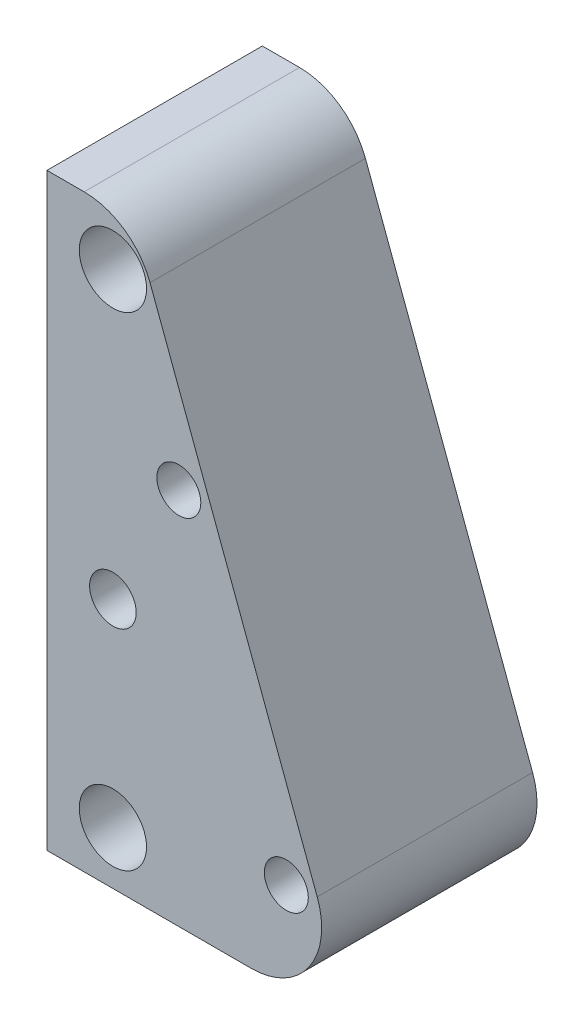
ISO-10303-21;
HEADER;
FILE_DESCRIPTION(('STEP AP214'),'2;1');
FILE_NAME('part.step','',(''),(''),'','','');
FILE_SCHEMA(('AUTOMOTIVE_DESIGN { 1 0 10303 214 1 1 1 1 }'));
ENDSEC;
DATA;
#1=APPLICATION_CONTEXT('core data for automotive mechanical design processes');
#2=APPLICATION_PROTOCOL_DEFINITION('international standard','automotive_design',2000,#1);
#3=PRODUCT_CONTEXT('',#1,'mechanical');
#4=PRODUCT('Part','Part','',(#3));
#5=PRODUCT_RELATED_PRODUCT_CATEGORY('part','',(#4));
#6=PRODUCT_DEFINITION_FORMATION('','',#4);
#7=PRODUCT_DEFINITION_CONTEXT('part definition',#1,'design');
#8=PRODUCT_DEFINITION('design','',#6,#7);
#9=PRODUCT_DEFINITION_SHAPE('','',#8);
#10=(LENGTH_UNIT() NAMED_UNIT(*) SI_UNIT(.MILLI.,.METRE.));
#11=(NAMED_UNIT(*) PLANE_ANGLE_UNIT() SI_UNIT($,.RADIAN.));
#12=(NAMED_UNIT(*) SI_UNIT($,.STERADIAN.) SOLID_ANGLE_UNIT());
#13=UNCERTAINTY_MEASURE_WITH_UNIT(LENGTH_MEASURE(1.E-05),#10,'distance_accuracy_value','');
#14=(GEOMETRIC_REPRESENTATION_CONTEXT(3) GLOBAL_UNCERTAINTY_ASSIGNED_CONTEXT((#13)) GLOBAL_UNIT_ASSIGNED_CONTEXT((#10,
#11,#12)) REPRESENTATION_CONTEXT('',''));
#15=CARTESIAN_POINT('',(0.,0.,0.));
#16=DIRECTION('',(0.,0.,1.));
#17=DIRECTION('',(1.,0.,0.));
#18=AXIS2_PLACEMENT_3D('',#15,#16,#17);
#19=CARTESIAN_POINT('',(0.,0.,49.));
#20=DIRECTION('',(0.,0.,-1.));
#21=DIRECTION('',(-1.,0.,0.));
#22=AXIS2_PLACEMENT_3D('',#19,#20,#21);
#23=CYLINDRICAL_SURFACE('',#22,5.3);
#24=CARTESIAN_POINT('',(0.,0.,49.));
#25=DIRECTION('',(0.,0.,1.));
#26=DIRECTION('',(1.,0.,0.));
#27=AXIS2_PLACEMENT_3D('',#24,#25,#26);
#28=CIRCLE('',#27,5.3);
#29=CARTESIAN_POINT('',(5.3,0.,49.));
#30=VERTEX_POINT('',#29);
#31=EDGE_CURVE('E191',#30,#30,#28,.T.);
#32=ORIENTED_EDGE('',*,*,#31,.T.);
#33=EDGE_LOOP('',(#32));
#34=FACE_BOUND('',#33,.T.);
#35=CARTESIAN_POINT('',(0.,0.,4.));
#36=DIRECTION('',(0.,0.,-1.));
#37=DIRECTION('',(-1.,0.,0.));
#38=AXIS2_PLACEMENT_3D('',#35,#36,#37);
#39=CIRCLE('',#38,5.3);
#40=CARTESIAN_POINT('',(-5.3,0.,4.));
#41=VERTEX_POINT('',#40);
#42=EDGE_CURVE('E49',#41,#41,#39,.T.);
#43=ORIENTED_EDGE('',*,*,#42,.T.);
#44=EDGE_LOOP('',(#43));
#45=FACE_BOUND('',#44,.T.);
#46=ADVANCED_FACE('F45',(#34,#45),#23,.F.);
#47=CARTESIAN_POINT('',(0.,0.,49.));
#48=DIRECTION('',(0.,0.,-1.));
#49=DIRECTION('',(-1.,0.,0.));
#50=AXIS2_PLACEMENT_3D('',#47,#48,#49);
#51=PLANE('',#50);
#52=DIRECTION('',(-0.349389847328426,0.936977446144687,0.));
#53=VECTOR('',#52,1.);
#54=CARTESIAN_POINT('',(4.57209406483869,77.,49.));
#55=LINE('',#54,#53);
#56=CARTESIAN_POINT('',(46.488609664757,-35.4097624427452,49.));
#57=VERTEX_POINT('',#56);
#58=CARTESIAN_POINT('',(8.45379401990281,66.5902375572548,49.));
#59=VERTEX_POINT('',#58);
#60=EDGE_CURVE('E113',#57,#59,#55,.T.);
#61=ORIENTED_EDGE('',*,*,#60,.T.);
#62=CARTESIAN_POINT('',(-6.53784511841218,61.,49.));
#63=DIRECTION('',(0.,0.,-1.));
#64=DIRECTION('',(-1.,0.,0.));
#65=AXIS2_PLACEMENT_3D('',#62,#63,#64);
#66=CIRCLE('',#65,16.);
#67=CARTESIAN_POINT('',(-6.53784511841218,77.,49.));
#68=VERTEX_POINT('',#67);
#69=EDGE_CURVE('E55',#59,#68,#66,.F.);
#70=ORIENTED_EDGE('',*,*,#69,.T.);
#71=DIRECTION('',(-1.,0.,0.));
#72=VECTOR('',#71,1.);
#73=CARTESIAN_POINT('',(-15.,77.,49.));
#74=LINE('',#73,#72);
#75=CARTESIAN_POINT('',(-15.,77.,49.));
#76=VERTEX_POINT('',#75);
#77=EDGE_CURVE('E101',#68,#76,#74,.T.);
#78=ORIENTED_EDGE('',*,*,#77,.T.);
#79=DIRECTION('',(0.,-1.,0.));
#80=VECTOR('',#79,1.);
#81=CARTESIAN_POINT('',(-15.,-57.,49.));
#82=LINE('',#81,#80);
#83=CARTESIAN_POINT('',(-15.,-57.,49.));
#84=VERTEX_POINT('',#83);
#85=EDGE_CURVE('E106',#76,#84,#82,.T.);
#86=ORIENTED_EDGE('',*,*,#85,.T.);
#87=DIRECTION('',(1.,0.,0.));
#88=VECTOR('',#87,1.);
#89=CARTESIAN_POINT('',(54.5394008923923,-57.,49.));
#90=LINE('',#89,#88);
#91=CARTESIAN_POINT('',(31.4969705264421,-57.,49.));
#92=VERTEX_POINT('',#91);
#93=EDGE_CURVE('E145',#84,#92,#90,.T.);
#94=ORIENTED_EDGE('',*,*,#93,.T.);
#95=CARTESIAN_POINT('',(31.4969705264421,-41.,49.));
#96=DIRECTION('',(0.,0.,-1.));
#97=DIRECTION('',(-1.,0.,0.));
#98=AXIS2_PLACEMENT_3D('',#95,#96,#97);
#99=CIRCLE('',#98,16.);
#100=EDGE_CURVE('E161',#92,#57,#99,.F.);
#101=ORIENTED_EDGE('',*,*,#100,.T.);
#102=EDGE_LOOP('',(#61,#70,#78,#86,#94,#101));
#103=FACE_BOUND('',#102,.T.);
#104=CARTESIAN_POINT('',(0.,65.,49.));
#105=DIRECTION('',(0.,0.,1.));
#106=DIRECTION('',(1.,0.,0.));
#107=AXIS2_PLACEMENT_3D('',#104,#105,#106);
#108=CIRCLE('',#107,7.65);
#109=CARTESIAN_POINT('',(7.65,65.,49.));
#110=VERTEX_POINT('',#109);
#111=EDGE_CURVE('E138',#110,#110,#108,.T.);
#112=ORIENTED_EDGE('',*,*,#111,.F.);
#113=EDGE_LOOP('',(#112));
#114=FACE_BOUND('',#113,.T.);
#115=CARTESIAN_POINT('',(0.,-45.,49.));
#116=DIRECTION('',(0.,0.,1.));
#117=DIRECTION('',(1.,0.,0.));
#118=AXIS2_PLACEMENT_3D('',#115,#116,#117);
#119=CIRCLE('',#118,7.65);
#120=CARTESIAN_POINT('',(7.65,-45.,49.));
#121=VERTEX_POINT('',#120);
#122=EDGE_CURVE('E183',#121,#121,#119,.T.);
#123=ORIENTED_EDGE('',*,*,#122,.F.);
#124=EDGE_LOOP('',(#123));
#125=FACE_BOUND('',#124,.T.);
#126=ORIENTED_EDGE('',*,*,#31,.F.);
#127=EDGE_LOOP('',(#126));
#128=FACE_BOUND('',#127,.T.);
#129=CARTESIAN_POINT('',(15.,29.,49.));
#130=DIRECTION('',(0.,0.,1.));
#131=DIRECTION('',(1.,0.,0.));
#132=AXIS2_PLACEMENT_3D('',#129,#130,#131);
#133=CIRCLE('',#132,5.);
#134=CARTESIAN_POINT('',(20.,29.,49.));
#135=VERTEX_POINT('',#134);
#136=EDGE_CURVE('E198',#135,#135,#133,.T.);
#137=ORIENTED_EDGE('',*,*,#136,.F.);
#138=EDGE_LOOP('',(#137));
#139=FACE_BOUND('',#138,.T.);
#140=CARTESIAN_POINT('',(39.4572893129898,-36.5884212301281,49.));
#141=DIRECTION('',(0.,0.,1.));
#142=DIRECTION('',(1.,0.,0.));
#143=AXIS2_PLACEMENT_3D('',#140,#141,#142);
#144=CIRCLE('',#143,5.00000000000001);
#145=CARTESIAN_POINT('',(44.4572893129898,-36.5884212301281,49.));
#146=VERTEX_POINT('',#145);
#147=EDGE_CURVE('E203',#146,#146,#144,.T.);
#148=ORIENTED_EDGE('',*,*,#147,.F.);
#149=EDGE_LOOP('',(#148));
#150=FACE_BOUND('',#149,.T.);
#151=ADVANCED_FACE('F103',(#103,#114,#125,#128,#139,#150),#51,.F.);
#152=CARTESIAN_POINT('',(0.,0.,0.));
#153=DIRECTION('',(0.,0.,-1.));
#154=DIRECTION('',(-1.,0.,0.));
#155=AXIS2_PLACEMENT_3D('',#152,#153,#154);
#156=PLANE('',#155);
#157=CARTESIAN_POINT('',(0.,0.,0.));
#158=DIRECTION('',(0.,0.,-1.));
#159=DIRECTION('',(-1.,0.,0.));
#160=AXIS2_PLACEMENT_3D('',#157,#158,#159);
#161=CIRCLE('',#160,11.);
#162=CARTESIAN_POINT('',(-11.,0.,0.));
#163=VERTEX_POINT('',#162);
#164=EDGE_CURVE('E214',#163,#163,#161,.T.);
#165=ORIENTED_EDGE('',*,*,#164,.F.);
#166=EDGE_LOOP('',(#165));
#167=FACE_BOUND('',#166,.T.);
#168=CARTESIAN_POINT('',(15.,29.,0.));
#169=DIRECTION('',(0.,0.,1.));
#170=DIRECTION('',(1.,0.,0.));
#171=AXIS2_PLACEMENT_3D('',#168,#169,#170);
#172=CIRCLE('',#171,5.);
#173=CARTESIAN_POINT('',(20.,29.,0.));
#174=VERTEX_POINT('',#173);
#175=EDGE_CURVE('E199',#174,#174,#172,.T.);
#176=ORIENTED_EDGE('',*,*,#175,.T.);
#177=EDGE_LOOP('',(#176));
#178=FACE_BOUND('',#177,.T.);
#179=CARTESIAN_POINT('',(0.,-45.,0.));
#180=DIRECTION('',(0.,0.,1.));
#181=DIRECTION('',(1.,0.,0.));
#182=AXIS2_PLACEMENT_3D('',#179,#180,#181);
#183=CIRCLE('',#182,7.65);
#184=CARTESIAN_POINT('',(7.65,-45.,0.));
#185=VERTEX_POINT('',#184);
#186=EDGE_CURVE('E187',#185,#185,#183,.T.);
#187=ORIENTED_EDGE('',*,*,#186,.T.);
#188=EDGE_LOOP('',(#187));
#189=FACE_BOUND('',#188,.T.);
#190=DIRECTION('',(-1.,0.,0.));
#191=VECTOR('',#190,1.);
#192=CARTESIAN_POINT('',(-15.,77.,0.));
#193=LINE('',#192,#191);
#194=CARTESIAN_POINT('',(-6.53784511841218,77.,0.));
#195=VERTEX_POINT('',#194);
#196=CARTESIAN_POINT('',(-15.,77.,0.));
#197=VERTEX_POINT('',#196);
#198=EDGE_CURVE('E119',#195,#197,#193,.T.);
#199=ORIENTED_EDGE('',*,*,#198,.F.);
#200=CARTESIAN_POINT('',(-6.53784511841218,61.,0.));
#201=DIRECTION('',(0.,0.,-1.));
#202=DIRECTION('',(-1.,0.,0.));
#203=AXIS2_PLACEMENT_3D('',#200,#201,#202);
#204=CIRCLE('',#203,16.);
#205=CARTESIAN_POINT('',(8.45379401990281,66.5902375572548,0.));
#206=VERTEX_POINT('',#205);
#207=EDGE_CURVE('E152',#195,#206,#204,.T.);
#208=ORIENTED_EDGE('',*,*,#207,.T.);
#209=DIRECTION('',(-0.349389847328426,0.936977446144687,0.));
#210=VECTOR('',#209,1.);
#211=CARTESIAN_POINT('',(4.57209406483869,77.,0.));
#212=LINE('',#211,#210);
#213=CARTESIAN_POINT('',(46.488609664757,-35.4097624427452,0.));
#214=VERTEX_POINT('',#213);
#215=EDGE_CURVE('E137',#214,#206,#212,.T.);
#216=ORIENTED_EDGE('',*,*,#215,.F.);
#217=CARTESIAN_POINT('',(31.4969705264421,-41.,0.));
#218=DIRECTION('',(0.,0.,-1.));
#219=DIRECTION('',(-1.,0.,0.));
#220=AXIS2_PLACEMENT_3D('',#217,#218,#219);
#221=CIRCLE('',#220,16.);
#222=CARTESIAN_POINT('',(31.4969705264421,-57.,0.));
#223=VERTEX_POINT('',#222);
#224=EDGE_CURVE('E149',#214,#223,#221,.T.);
#225=ORIENTED_EDGE('',*,*,#224,.T.);
#226=DIRECTION('',(1.,0.,0.));
#227=VECTOR('',#226,1.);
#228=CARTESIAN_POINT('',(54.5394008923923,-57.,0.));
#229=LINE('',#228,#227);
#230=CARTESIAN_POINT('',(-15.,-57.,0.));
#231=VERTEX_POINT('',#230);
#232=EDGE_CURVE('E134',#231,#223,#229,.T.);
#233=ORIENTED_EDGE('',*,*,#232,.F.);
#234=DIRECTION('',(0.,-1.,0.));
#235=VECTOR('',#234,1.);
#236=CARTESIAN_POINT('',(-15.,-57.,0.));
#237=LINE('',#236,#235);
#238=EDGE_CURVE('E143',#197,#231,#237,.T.);
#239=ORIENTED_EDGE('',*,*,#238,.F.);
#240=EDGE_LOOP('',(#199,#208,#216,#225,#233,#239));
#241=FACE_BOUND('',#240,.T.);
#242=CARTESIAN_POINT('',(0.,65.,0.));
#243=DIRECTION('',(0.,0.,1.));
#244=DIRECTION('',(1.,0.,0.));
#245=AXIS2_PLACEMENT_3D('',#242,#243,#244);
#246=CIRCLE('',#245,7.65);
#247=CARTESIAN_POINT('',(7.65,65.,0.));
#248=VERTEX_POINT('',#247);
#249=EDGE_CURVE('E179',#248,#248,#246,.T.);
#250=ORIENTED_EDGE('',*,*,#249,.T.);
#251=EDGE_LOOP('',(#250));
#252=FACE_BOUND('',#251,.T.);
#253=CARTESIAN_POINT('',(39.4572893129898,-36.5884212301281,0.));
#254=DIRECTION('',(0.,0.,1.));
#255=DIRECTION('',(1.,0.,0.));
#256=AXIS2_PLACEMENT_3D('',#253,#254,#255);
#257=CIRCLE('',#256,5.00000000000001);
#258=CARTESIAN_POINT('',(44.4572893129898,-36.5884212301281,0.));
#259=VERTEX_POINT('',#258);
#260=EDGE_CURVE('E207',#259,#259,#257,.T.);
#261=ORIENTED_EDGE('',*,*,#260,.T.);
#262=EDGE_LOOP('',(#261));
#263=FACE_BOUND('',#262,.T.);
#264=ADVANCED_FACE('F173',(#167,#178,#189,#241,#252,#263),#156,.T.);
#265=CARTESIAN_POINT('',(54.5394008923923,-57.,49.));
#266=DIRECTION('',(0.,1.,0.));
#267=DIRECTION('',(-1.,0.,0.));
#268=AXIS2_PLACEMENT_3D('',#265,#266,#267);
#269=PLANE('',#268);
#270=ORIENTED_EDGE('',*,*,#232,.T.);
#271=DIRECTION('',(0.,0.,-1.));
#272=VECTOR('',#271,1.);
#273=CARTESIAN_POINT('',(31.4969705264421,-57.,49.));
#274=LINE('',#273,#272);
#275=EDGE_CURVE('E11',#223,#92,#274,.F.);
#276=ORIENTED_EDGE('',*,*,#275,.T.);
#277=ORIENTED_EDGE('',*,*,#93,.F.);
#278=DIRECTION('',(0.,0.,-1.));
#279=VECTOR('',#278,1.);
#280=CARTESIAN_POINT('',(-15.,-57.,49.));
#281=LINE('',#280,#279);
#282=EDGE_CURVE('E124',#84,#231,#281,.T.);
#283=ORIENTED_EDGE('',*,*,#282,.T.);
#284=EDGE_LOOP('',(#270,#276,#277,#283));
#285=FACE_BOUND('',#284,.T.);
#286=ADVANCED_FACE('F175',(#285),#269,.F.);
#287=CARTESIAN_POINT('',(4.57209406483869,77.,49.));
#288=DIRECTION('',(-0.936977446144687,-0.349389847328426,0.));
#289=DIRECTION('',(0.349389847328426,-0.936977446144687,0.));
#290=AXIS2_PLACEMENT_3D('',#287,#288,#289);
#291=PLANE('',#290);
#292=ORIENTED_EDGE('',*,*,#215,.T.);
#293=DIRECTION('',(0.,0.,-1.));
#294=VECTOR('',#293,1.);
#295=CARTESIAN_POINT('',(8.45379401990281,66.5902375572548,49.));
#296=LINE('',#295,#294);
#297=EDGE_CURVE('E68',#206,#59,#296,.F.);
#298=ORIENTED_EDGE('',*,*,#297,.T.);
#299=ORIENTED_EDGE('',*,*,#60,.F.);
#300=DIRECTION('',(0.,0.,-1.));
#301=VECTOR('',#300,1.);
#302=CARTESIAN_POINT('',(46.488609664757,-35.4097624427451,49.));
#303=LINE('',#302,#301);
#304=EDGE_CURVE('E155',#57,#214,#303,.T.);
#305=ORIENTED_EDGE('',*,*,#304,.T.);
#306=EDGE_LOOP('',(#292,#298,#299,#305));
#307=FACE_BOUND('',#306,.T.);
#308=ADVANCED_FACE('F168',(#307),#291,.F.);
#309=CARTESIAN_POINT('',(-15.,77.,49.));
#310=DIRECTION('',(0.,-1.,0.));
#311=DIRECTION('',(0.,0.,-1.));
#312=AXIS2_PLACEMENT_3D('',#309,#310,#311);
#313=PLANE('',#312);
#314=ORIENTED_EDGE('',*,*,#77,.F.);
#315=DIRECTION('',(0.,0.,-1.));
#316=VECTOR('',#315,1.);
#317=CARTESIAN_POINT('',(-6.53784511841218,77.,49.));
#318=LINE('',#317,#316);
#319=EDGE_CURVE('E123',#68,#195,#318,.T.);
#320=ORIENTED_EDGE('',*,*,#319,.T.);
#321=ORIENTED_EDGE('',*,*,#198,.T.);
#322=DIRECTION('',(0.,0.,-1.));
#323=VECTOR('',#322,1.);
#324=CARTESIAN_POINT('',(-15.,77.,49.));
#325=LINE('',#324,#323);
#326=EDGE_CURVE('E116',#76,#197,#325,.T.);
#327=ORIENTED_EDGE('',*,*,#326,.F.);
#328=EDGE_LOOP('',(#314,#320,#321,#327));
#329=FACE_BOUND('',#328,.T.);
#330=ADVANCED_FACE('F117',(#329),#313,.F.);
#331=CARTESIAN_POINT('',(-15.,-57.,49.));
#332=DIRECTION('',(1.,0.,0.));
#333=DIRECTION('',(0.,0.,-1.));
#334=AXIS2_PLACEMENT_3D('',#331,#332,#333);
#335=PLANE('',#334);
#336=ORIENTED_EDGE('',*,*,#238,.T.);
#337=ORIENTED_EDGE('',*,*,#282,.F.);
#338=ORIENTED_EDGE('',*,*,#85,.F.);
#339=ORIENTED_EDGE('',*,*,#326,.T.);
#340=EDGE_LOOP('',(#336,#337,#338,#339));
#341=FACE_BOUND('',#340,.T.);
#342=ADVANCED_FACE('F126',(#341),#335,.F.);
#343=CARTESIAN_POINT('',(0.,65.,49.));
#344=DIRECTION('',(0.,0.,-1.));
#345=DIRECTION('',(-1.,0.,0.));
#346=AXIS2_PLACEMENT_3D('',#343,#344,#345);
#347=CYLINDRICAL_SURFACE('',#346,7.65);
#348=ORIENTED_EDGE('',*,*,#111,.T.);
#349=EDGE_LOOP('',(#348));
#350=FACE_BOUND('',#349,.T.);
#351=ORIENTED_EDGE('',*,*,#249,.F.);
#352=EDGE_LOOP('',(#351));
#353=FACE_BOUND('',#352,.T.);
#354=ADVANCED_FACE('F296',(#350,#353),#347,.F.);
#355=CARTESIAN_POINT('',(0.,-45.,49.));
#356=DIRECTION('',(0.,0.,-1.));
#357=DIRECTION('',(-1.,0.,0.));
#358=AXIS2_PLACEMENT_3D('',#355,#356,#357);
#359=CYLINDRICAL_SURFACE('',#358,7.65);
#360=ORIENTED_EDGE('',*,*,#122,.T.);
#361=EDGE_LOOP('',(#360));
#362=FACE_BOUND('',#361,.T.);
#363=ORIENTED_EDGE('',*,*,#186,.F.);
#364=EDGE_LOOP('',(#363));
#365=FACE_BOUND('',#364,.T.);
#366=ADVANCED_FACE('F293',(#362,#365),#359,.F.);
#367=CARTESIAN_POINT('',(15.,29.,49.));
#368=DIRECTION('',(0.,0.,-1.));
#369=DIRECTION('',(-1.,0.,0.));
#370=AXIS2_PLACEMENT_3D('',#367,#368,#369);
#371=CYLINDRICAL_SURFACE('',#370,5.);
#372=ORIENTED_EDGE('',*,*,#136,.T.);
#373=EDGE_LOOP('',(#372));
#374=FACE_BOUND('',#373,.T.);
#375=ORIENTED_EDGE('',*,*,#175,.F.);
#376=EDGE_LOOP('',(#375));
#377=FACE_BOUND('',#376,.T.);
#378=ADVANCED_FACE('F295',(#374,#377),#371,.F.);
#379=CARTESIAN_POINT('',(39.4572893129898,-36.5884212301281,49.));
#380=DIRECTION('',(0.,0.,-1.));
#381=DIRECTION('',(-1.,0.,0.));
#382=AXIS2_PLACEMENT_3D('',#379,#380,#381);
#383=CYLINDRICAL_SURFACE('',#382,5.00000000000001);
#384=ORIENTED_EDGE('',*,*,#147,.T.);
#385=EDGE_LOOP('',(#384));
#386=FACE_BOUND('',#385,.T.);
#387=ORIENTED_EDGE('',*,*,#260,.F.);
#388=EDGE_LOOP('',(#387));
#389=FACE_BOUND('',#388,.T.);
#390=ADVANCED_FACE('F303',(#386,#389),#383,.F.);
#391=CARTESIAN_POINT('',(-6.53784511841218,61.,49.));
#392=DIRECTION('',(0.,0.,-1.));
#393=DIRECTION('',(-1.,0.,0.));
#394=AXIS2_PLACEMENT_3D('',#391,#392,#393);
#395=CYLINDRICAL_SURFACE('',#394,16.);
#396=ORIENTED_EDGE('',*,*,#69,.F.);
#397=ORIENTED_EDGE('',*,*,#297,.F.);
#398=ORIENTED_EDGE('',*,*,#207,.F.);
#399=ORIENTED_EDGE('',*,*,#319,.F.);
#400=EDGE_LOOP('',(#396,#397,#398,#399));
#401=FACE_BOUND('',#400,.T.);
#402=ADVANCED_FACE('F319',(#401),#395,.T.);
#403=CARTESIAN_POINT('',(31.4969705264421,-41.,49.));
#404=DIRECTION('',(0.,0.,-1.));
#405=DIRECTION('',(-1.,0.,0.));
#406=AXIS2_PLACEMENT_3D('',#403,#404,#405);
#407=CYLINDRICAL_SURFACE('',#406,16.);
#408=ORIENTED_EDGE('',*,*,#100,.F.);
#409=ORIENTED_EDGE('',*,*,#275,.F.);
#410=ORIENTED_EDGE('',*,*,#224,.F.);
#411=ORIENTED_EDGE('',*,*,#304,.F.);
#412=EDGE_LOOP('',(#408,#409,#410,#411));
#413=FACE_BOUND('',#412,.T.);
#414=ADVANCED_FACE('F47',(#413),#407,.T.);
#415=CARTESIAN_POINT('',(0.,0.,4.));
#416=DIRECTION('',(0.,0.,-1.));
#417=DIRECTION('',(-1.,0.,0.));
#418=AXIS2_PLACEMENT_3D('',#415,#416,#417);
#419=CYLINDRICAL_SURFACE('',#418,11.);
#420=CARTESIAN_POINT('',(0.,0.,4.));
#421=DIRECTION('',(0.,0.,-1.));
#422=DIRECTION('',(-1.,0.,0.));
#423=AXIS2_PLACEMENT_3D('',#420,#421,#422);
#424=CIRCLE('',#423,11.);
#425=CARTESIAN_POINT('',(-11.,0.,4.));
#426=VERTEX_POINT('',#425);
#427=EDGE_CURVE('E218',#426,#426,#424,.T.);
#428=ORIENTED_EDGE('',*,*,#427,.F.);
#429=EDGE_LOOP('',(#428));
#430=FACE_BOUND('',#429,.T.);
#431=ORIENTED_EDGE('',*,*,#164,.T.);
#432=EDGE_LOOP('',(#431));
#433=FACE_BOUND('',#432,.T.);
#434=ADVANCED_FACE('F268',(#430,#433),#419,.F.);
#435=CARTESIAN_POINT('',(0.,0.,4.));
#436=DIRECTION('',(0.,0.,-1.));
#437=DIRECTION('',(-1.,0.,0.));
#438=AXIS2_PLACEMENT_3D('',#435,#436,#437);
#439=PLANE('',#438);
#440=CARTESIAN_POINT('',(0.,8.,4.));
#441=DIRECTION('',(0.,0.,-1.));
#442=DIRECTION('',(-1.,0.,0.));
#443=AXIS2_PLACEMENT_3D('',#440,#441,#442);
#444=CIRCLE('',#443,1.21);
#445=CARTESIAN_POINT('',(-1.21,8.,4.));
#446=VERTEX_POINT('',#445);
#447=EDGE_CURVE('E247',#446,#446,#444,.T.);
#448=ORIENTED_EDGE('',*,*,#447,.F.);
#449=EDGE_LOOP('',(#448));
#450=FACE_BOUND('',#449,.T.);
#451=CARTESIAN_POINT('',(-8.,0.,4.));
#452=DIRECTION('',(0.,0.,-1.));
#453=DIRECTION('',(-1.,0.,0.));
#454=AXIS2_PLACEMENT_3D('',#451,#452,#453);
#455=CIRCLE('',#454,1.21);
#456=CARTESIAN_POINT('',(-9.21,0.,4.));
#457=VERTEX_POINT('',#456);
#458=EDGE_CURVE('E243',#457,#457,#455,.T.);
#459=ORIENTED_EDGE('',*,*,#458,.F.);
#460=EDGE_LOOP('',(#459));
#461=FACE_BOUND('',#460,.T.);
#462=CARTESIAN_POINT('',(0.,-8.,4.));
#463=DIRECTION('',(0.,0.,-1.));
#464=DIRECTION('',(-1.,0.,0.));
#465=AXIS2_PLACEMENT_3D('',#462,#463,#464);
#466=CIRCLE('',#465,1.21);
#467=CARTESIAN_POINT('',(-1.20999999999994,-8.,4.));
#468=VERTEX_POINT('',#467);
#469=EDGE_CURVE('E235',#468,#468,#466,.T.);
#470=ORIENTED_EDGE('',*,*,#469,.F.);
#471=EDGE_LOOP('',(#470));
#472=FACE_BOUND('',#471,.T.);
#473=CARTESIAN_POINT('',(8.,0.,4.));
#474=DIRECTION('',(0.,0.,-1.));
#475=DIRECTION('',(-1.,0.,0.));
#476=AXIS2_PLACEMENT_3D('',#473,#474,#475);
#477=CIRCLE('',#476,1.21);
#478=CARTESIAN_POINT('',(6.79,0.,4.));
#479=VERTEX_POINT('',#478);
#480=EDGE_CURVE('E227',#479,#479,#477,.T.);
#481=ORIENTED_EDGE('',*,*,#480,.F.);
#482=EDGE_LOOP('',(#481));
#483=FACE_BOUND('',#482,.T.);
#484=ORIENTED_EDGE('',*,*,#42,.F.);
#485=EDGE_LOOP('',(#484));
#486=FACE_BOUND('',#485,.T.);
#487=ORIENTED_EDGE('',*,*,#427,.T.);
#488=EDGE_LOOP('',(#487));
#489=FACE_BOUND('',#488,.T.);
#490=ADVANCED_FACE('F264',(#450,#461,#472,#483,#486,#489),#439,.T.);
#491=CARTESIAN_POINT('',(8.,0.,19.));
#492=DIRECTION('',(0.,0.,-1.));
#493=DIRECTION('',(-1.,0.,0.));
#494=AXIS2_PLACEMENT_3D('',#491,#492,#493);
#495=CYLINDRICAL_SURFACE('',#494,1.21);
#496=CARTESIAN_POINT('',(8.,0.,19.));
#497=DIRECTION('',(0.,0.,-1.));
#498=DIRECTION('',(-1.,0.,0.));
#499=AXIS2_PLACEMENT_3D('',#496,#497,#498);
#500=CIRCLE('',#499,1.21);
#501=CARTESIAN_POINT('',(6.79,0.,19.));
#502=VERTEX_POINT('',#501);
#503=EDGE_CURVE('E223',#502,#502,#500,.T.);
#504=ORIENTED_EDGE('',*,*,#503,.F.);
#505=EDGE_LOOP('',(#504));
#506=FACE_BOUND('',#505,.T.);
#507=ORIENTED_EDGE('',*,*,#480,.T.);
#508=EDGE_LOOP('',(#507));
#509=FACE_BOUND('',#508,.T.);
#510=ADVANCED_FACE('F267',(#506,#509),#495,.F.);
#511=CARTESIAN_POINT('',(8.,0.,19.));
#512=DIRECTION('',(0.,0.,-1.));
#513=DIRECTION('',(-1.,0.,0.));
#514=AXIS2_PLACEMENT_3D('',#511,#512,#513);
#515=PLANE('',#514);
#516=ORIENTED_EDGE('',*,*,#503,.T.);
#517=EDGE_LOOP('',(#516));
#518=FACE_BOUND('',#517,.T.);
#519=ADVANCED_FACE('F322',(#518),#515,.T.);
#520=CARTESIAN_POINT('',(0.,-8.,19.));
#521=DIRECTION('',(0.,0.,-1.));
#522=DIRECTION('',(-1.,0.,0.));
#523=AXIS2_PLACEMENT_3D('',#520,#521,#522);
#524=CYLINDRICAL_SURFACE('',#523,1.21);
#525=CARTESIAN_POINT('',(0.,-8.,19.));
#526=DIRECTION('',(0.,0.,-1.));
#527=DIRECTION('',(-1.,0.,0.));
#528=AXIS2_PLACEMENT_3D('',#525,#526,#527);
#529=CIRCLE('',#528,1.21);
#530=CARTESIAN_POINT('',(-1.20999999999994,-8.,19.));
#531=VERTEX_POINT('',#530);
#532=EDGE_CURVE('E231',#531,#531,#529,.T.);
#533=ORIENTED_EDGE('',*,*,#532,.F.);
#534=EDGE_LOOP('',(#533));
#535=FACE_BOUND('',#534,.T.);
#536=ORIENTED_EDGE('',*,*,#469,.T.);
#537=EDGE_LOOP('',(#536));
#538=FACE_BOUND('',#537,.T.);
#539=ADVANCED_FACE('F325',(#535,#538),#524,.F.);
#540=CARTESIAN_POINT('',(0.,-8.,19.));
#541=DIRECTION('',(0.,0.,-1.));
#542=DIRECTION('',(-1.,0.,0.));
#543=AXIS2_PLACEMENT_3D('',#540,#541,#542);
#544=PLANE('',#543);
#545=ORIENTED_EDGE('',*,*,#532,.T.);
#546=EDGE_LOOP('',(#545));
#547=FACE_BOUND('',#546,.T.);
#548=ADVANCED_FACE('F330',(#547),#544,.T.);
#549=CARTESIAN_POINT('',(-8.,0.,19.));
#550=DIRECTION('',(0.,0.,-1.));
#551=DIRECTION('',(-1.,0.,0.));
#552=AXIS2_PLACEMENT_3D('',#549,#550,#551);
#553=CYLINDRICAL_SURFACE('',#552,1.21);
#554=CARTESIAN_POINT('',(-8.,0.,19.));
#555=DIRECTION('',(0.,0.,-1.));
#556=DIRECTION('',(-1.,0.,0.));
#557=AXIS2_PLACEMENT_3D('',#554,#555,#556);
#558=CIRCLE('',#557,1.21);
#559=CARTESIAN_POINT('',(-9.21,0.,19.));
#560=VERTEX_POINT('',#559);
#561=EDGE_CURVE('E239',#560,#560,#558,.T.);
#562=ORIENTED_EDGE('',*,*,#561,.F.);
#563=EDGE_LOOP('',(#562));
#564=FACE_BOUND('',#563,.T.);
#565=ORIENTED_EDGE('',*,*,#458,.T.);
#566=EDGE_LOOP('',(#565));
#567=FACE_BOUND('',#566,.T.);
#568=ADVANCED_FACE('F333',(#564,#567),#553,.F.);
#569=CARTESIAN_POINT('',(-8.,0.,19.));
#570=DIRECTION('',(0.,0.,-1.));
#571=DIRECTION('',(-1.,0.,0.));
#572=AXIS2_PLACEMENT_3D('',#569,#570,#571);
#573=PLANE('',#572);
#574=ORIENTED_EDGE('',*,*,#561,.T.);
#575=EDGE_LOOP('',(#574));
#576=FACE_BOUND('',#575,.T.);
#577=ADVANCED_FACE('F260',(#576),#573,.T.);
#578=CARTESIAN_POINT('',(0.,8.,19.));
#579=DIRECTION('',(0.,0.,-1.));
#580=DIRECTION('',(-1.,0.,0.));
#581=AXIS2_PLACEMENT_3D('',#578,#579,#580);
#582=CYLINDRICAL_SURFACE('',#581,1.21);
#583=CARTESIAN_POINT('',(0.,8.,19.));
#584=DIRECTION('',(0.,0.,-1.));
#585=DIRECTION('',(-1.,0.,0.));
#586=AXIS2_PLACEMENT_3D('',#583,#584,#585);
#587=CIRCLE('',#586,1.21);
#588=CARTESIAN_POINT('',(-1.21,8.,19.));
#589=VERTEX_POINT('',#588);
#590=EDGE_CURVE('E219',#589,#589,#587,.T.);
#591=ORIENTED_EDGE('',*,*,#590,.F.);
#592=EDGE_LOOP('',(#591));
#593=FACE_BOUND('',#592,.T.);
#594=ORIENTED_EDGE('',*,*,#447,.T.);
#595=EDGE_LOOP('',(#594));
#596=FACE_BOUND('',#595,.T.);
#597=ADVANCED_FACE('F257',(#593,#596),#582,.F.);
#598=CARTESIAN_POINT('',(0.,8.,19.));
#599=DIRECTION('',(0.,0.,-1.));
#600=DIRECTION('',(-1.,0.,0.));
#601=AXIS2_PLACEMENT_3D('',#598,#599,#600);
#602=PLANE('',#601);
#603=ORIENTED_EDGE('',*,*,#590,.T.);
#604=EDGE_LOOP('',(#603));
#605=FACE_BOUND('',#604,.T.);
#606=ADVANCED_FACE('F255',(#605),#602,.T.);
#607=CLOSED_SHELL('',(#46,#151,#264,#286,#308,#330,#342,#354,#366,#378,#390,#402,#414,#434,#490,
#510,#519,#539,#548,#568,#577,#597,#606));
#608=MANIFOLD_SOLID_BREP('B2',#607);
#609=ADVANCED_BREP_SHAPE_REPRESENTATION('',(#18,#608),#14);
#610=SHAPE_DEFINITION_REPRESENTATION(#9,#609);
ENDSEC;
END-ISO-10303-21;
